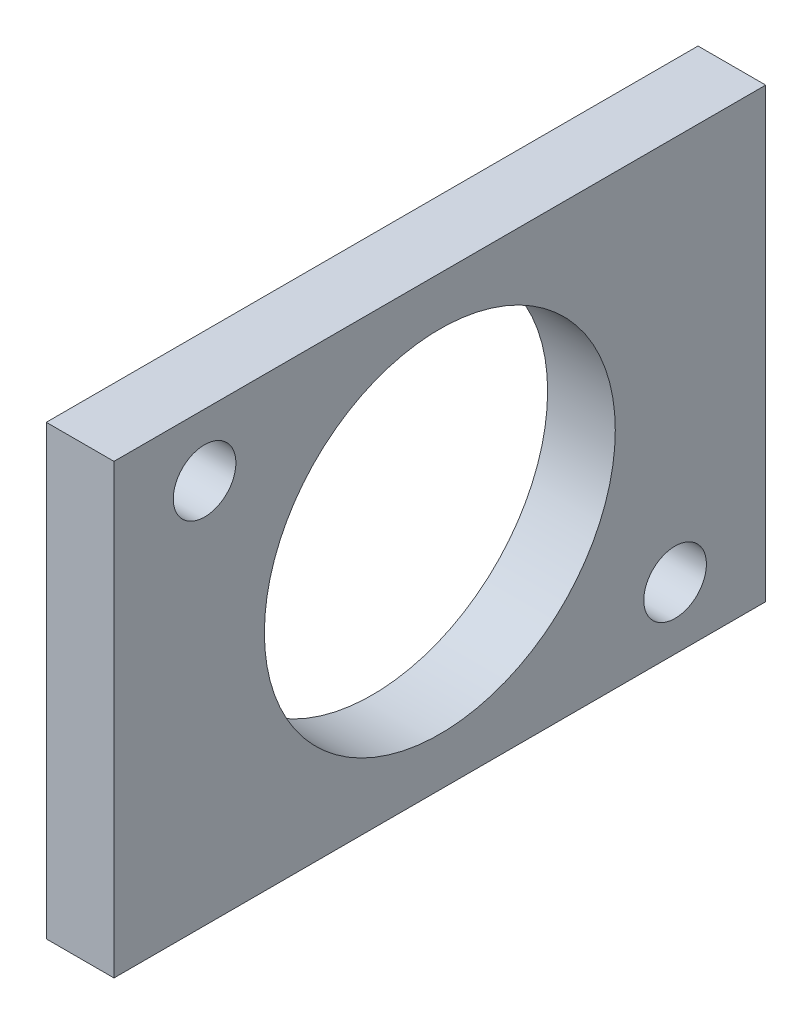
ISO-10303-21;
HEADER;
FILE_DESCRIPTION(('STEP AP214'),'2;1');
FILE_NAME('part.step','',(''),(''),'','','');
FILE_SCHEMA(('AUTOMOTIVE_DESIGN { 1 0 10303 214 1 1 1 1 }'));
ENDSEC;
DATA;
#1=APPLICATION_CONTEXT('core data for automotive mechanical design processes');
#2=APPLICATION_PROTOCOL_DEFINITION('international standard','automotive_design',2000,#1);
#3=PRODUCT_CONTEXT('',#1,'mechanical');
#4=PRODUCT('Part','Part','',(#3));
#5=PRODUCT_RELATED_PRODUCT_CATEGORY('part','',(#4));
#6=PRODUCT_DEFINITION_FORMATION('','',#4);
#7=PRODUCT_DEFINITION_CONTEXT('part definition',#1,'design');
#8=PRODUCT_DEFINITION('design','',#6,#7);
#9=PRODUCT_DEFINITION_SHAPE('','',#8);
#10=(LENGTH_UNIT() NAMED_UNIT(*) SI_UNIT(.MILLI.,.METRE.));
#11=(NAMED_UNIT(*) PLANE_ANGLE_UNIT() SI_UNIT($,.RADIAN.));
#12=(NAMED_UNIT(*) SI_UNIT($,.STERADIAN.) SOLID_ANGLE_UNIT());
#13=UNCERTAINTY_MEASURE_WITH_UNIT(LENGTH_MEASURE(1.E-05),#10,'distance_accuracy_value','');
#14=(GEOMETRIC_REPRESENTATION_CONTEXT(3) GLOBAL_UNCERTAINTY_ASSIGNED_CONTEXT((#13)) GLOBAL_UNIT_ASSIGNED_CONTEXT((#10,
#11,#12)) REPRESENTATION_CONTEXT('',''));
#15=CARTESIAN_POINT('',(0.,0.,0.));
#16=DIRECTION('',(0.,0.,1.));
#17=DIRECTION('',(1.,0.,0.));
#18=AXIS2_PLACEMENT_3D('',#15,#16,#17);
#19=CARTESIAN_POINT('',(5.4,17.85,-26.));
#20=DIRECTION('',(0.,0.,1.));
#21=DIRECTION('',(1.,0.,0.));
#22=AXIS2_PLACEMENT_3D('',#19,#20,#21);
#23=PLANE('',#22);
#24=DIRECTION('',(0.,1.,0.));
#25=VECTOR('',#24,1.);
#26=CARTESIAN_POINT('',(0.,17.85,-26.));
#27=LINE('',#26,#25);
#28=CARTESIAN_POINT('',(0.,-17.85,-26.));
#29=VERTEX_POINT('',#28);
#30=CARTESIAN_POINT('',(0.,17.85,-26.));
#31=VERTEX_POINT('',#30);
#32=EDGE_CURVE('E113',#29,#31,#27,.T.);
#33=ORIENTED_EDGE('',*,*,#32,.T.);
#34=DIRECTION('',(-1.,0.,0.));
#35=VECTOR('',#34,1.);
#36=CARTESIAN_POINT('',(5.4,17.85,-26.));
#37=LINE('',#36,#35);
#38=CARTESIAN_POINT('',(5.4,17.85,-26.));
#39=VERTEX_POINT('',#38);
#40=EDGE_CURVE('E11',#39,#31,#37,.T.);
#41=ORIENTED_EDGE('',*,*,#40,.F.);
#42=DIRECTION('',(0.,1.,0.));
#43=VECTOR('',#42,1.);
#44=CARTESIAN_POINT('',(5.4,17.85,-26.));
#45=LINE('',#44,#43);
#46=CARTESIAN_POINT('',(5.4,-17.85,-26.));
#47=VERTEX_POINT('',#46);
#48=EDGE_CURVE('E97',#47,#39,#45,.T.);
#49=ORIENTED_EDGE('',*,*,#48,.F.);
#50=DIRECTION('',(-1.,0.,0.));
#51=VECTOR('',#50,1.);
#52=CARTESIAN_POINT('',(5.4,-17.85,-26.));
#53=LINE('',#52,#51);
#54=EDGE_CURVE('E109',#47,#29,#53,.T.);
#55=ORIENTED_EDGE('',*,*,#54,.T.);
#56=EDGE_LOOP('',(#33,#41,#49,#55));
#57=FACE_BOUND('',#56,.T.);
#58=ADVANCED_FACE('F45',(#57),#23,.F.);
#59=CARTESIAN_POINT('',(5.4,17.85,26.));
#60=DIRECTION('',(0.,-1.,0.));
#61=DIRECTION('',(0.,0.,-1.));
#62=AXIS2_PLACEMENT_3D('',#59,#60,#61);
#63=PLANE('',#62);
#64=DIRECTION('',(0.,0.,1.));
#65=VECTOR('',#64,1.);
#66=CARTESIAN_POINT('',(0.,17.85,26.));
#67=LINE('',#66,#65);
#68=CARTESIAN_POINT('',(0.,17.85,26.));
#69=VERTEX_POINT('',#68);
#70=EDGE_CURVE('E102',#31,#69,#67,.T.);
#71=ORIENTED_EDGE('',*,*,#70,.T.);
#72=DIRECTION('',(-1.,0.,0.));
#73=VECTOR('',#72,1.);
#74=CARTESIAN_POINT('',(5.4,17.85,26.));
#75=LINE('',#74,#73);
#76=CARTESIAN_POINT('',(5.4,17.85,26.));
#77=VERTEX_POINT('',#76);
#78=EDGE_CURVE('E54',#77,#69,#75,.T.);
#79=ORIENTED_EDGE('',*,*,#78,.F.);
#80=DIRECTION('',(0.,0.,1.));
#81=VECTOR('',#80,1.);
#82=CARTESIAN_POINT('',(5.4,17.85,26.));
#83=LINE('',#82,#81);
#84=EDGE_CURVE('E92',#39,#77,#83,.T.);
#85=ORIENTED_EDGE('',*,*,#84,.F.);
#86=ORIENTED_EDGE('',*,*,#40,.T.);
#87=EDGE_LOOP('',(#71,#79,#85,#86));
#88=FACE_BOUND('',#87,.T.);
#89=ADVANCED_FACE('F101',(#88),#63,.F.);
#90=CARTESIAN_POINT('',(5.4,17.85,26.));
#91=DIRECTION('',(0.,0.,-1.));
#92=DIRECTION('',(0.,1.,0.));
#93=AXIS2_PLACEMENT_3D('',#90,#91,#92);
#94=PLANE('',#93);
#95=DIRECTION('',(0.,-1.,0.));
#96=VECTOR('',#95,1.);
#97=CARTESIAN_POINT('',(0.,17.85,26.));
#98=LINE('',#97,#96);
#99=CARTESIAN_POINT('',(0.,-17.85,26.));
#100=VERTEX_POINT('',#99);
#101=EDGE_CURVE('E79',#69,#100,#98,.T.);
#102=ORIENTED_EDGE('',*,*,#101,.T.);
#103=DIRECTION('',(-1.,0.,0.));
#104=VECTOR('',#103,1.);
#105=CARTESIAN_POINT('',(5.4,-17.85,26.));
#106=LINE('',#105,#104);
#107=CARTESIAN_POINT('',(5.4,-17.85,26.));
#108=VERTEX_POINT('',#107);
#109=EDGE_CURVE('E104',#108,#100,#106,.T.);
#110=ORIENTED_EDGE('',*,*,#109,.F.);
#111=DIRECTION('',(0.,-1.,0.));
#112=VECTOR('',#111,1.);
#113=CARTESIAN_POINT('',(5.4,17.85,26.));
#114=LINE('',#113,#112);
#115=EDGE_CURVE('E95',#77,#108,#114,.T.);
#116=ORIENTED_EDGE('',*,*,#115,.F.);
#117=ORIENTED_EDGE('',*,*,#78,.T.);
#118=EDGE_LOOP('',(#102,#110,#116,#117));
#119=FACE_BOUND('',#118,.T.);
#120=ADVANCED_FACE('F105',(#119),#94,.F.);
#121=CARTESIAN_POINT('',(5.4,-17.85,26.));
#122=DIRECTION('',(0.,1.,0.));
#123=DIRECTION('',(0.,0.,1.));
#124=AXIS2_PLACEMENT_3D('',#121,#122,#123);
#125=PLANE('',#124);
#126=DIRECTION('',(0.,0.,-1.));
#127=VECTOR('',#126,1.);
#128=CARTESIAN_POINT('',(0.,-17.85,26.));
#129=LINE('',#128,#127);
#130=EDGE_CURVE('E85',#100,#29,#129,.T.);
#131=ORIENTED_EDGE('',*,*,#130,.T.);
#132=ORIENTED_EDGE('',*,*,#54,.F.);
#133=DIRECTION('',(0.,0.,-1.));
#134=VECTOR('',#133,1.);
#135=CARTESIAN_POINT('',(5.4,-17.85,26.));
#136=LINE('',#135,#134);
#137=EDGE_CURVE('E62',#108,#47,#136,.T.);
#138=ORIENTED_EDGE('',*,*,#137,.F.);
#139=ORIENTED_EDGE('',*,*,#109,.T.);
#140=EDGE_LOOP('',(#131,#132,#138,#139));
#141=FACE_BOUND('',#140,.T.);
#142=ADVANCED_FACE('F127',(#141),#125,.F.);
#143=CARTESIAN_POINT('',(5.4,0.,0.));
#144=DIRECTION('',(1.,0.,0.));
#145=DIRECTION('',(0.,0.,-1.));
#146=AXIS2_PLACEMENT_3D('',#143,#144,#145);
#147=PLANE('',#146);
#148=CARTESIAN_POINT('',(5.4,-12.8869329433704,-18.7708827186347));
#149=DIRECTION('',(1.,0.,0.));
#150=DIRECTION('',(0.,0.,-1.));
#151=AXIS2_PLACEMENT_3D('',#148,#149,#150);
#152=CIRCLE('',#151,2.5);
#153=CARTESIAN_POINT('',(5.4,-12.8869329433704,-21.2708827186347));
#154=VERTEX_POINT('',#153);
#155=EDGE_CURVE('E146',#154,#154,#152,.T.);
#156=ORIENTED_EDGE('',*,*,#155,.F.);
#157=EDGE_LOOP('',(#156));
#158=FACE_BOUND('',#157,.T.);
#159=CARTESIAN_POINT('',(5.4,12.8869329433704,18.7708827186347));
#160=DIRECTION('',(1.,0.,0.));
#161=DIRECTION('',(0.,0.,-1.));
#162=AXIS2_PLACEMENT_3D('',#159,#160,#161);
#163=CIRCLE('',#162,2.5);
#164=CARTESIAN_POINT('',(5.4,12.8869329433704,16.2708827186347));
#165=VERTEX_POINT('',#164);
#166=EDGE_CURVE('E138',#165,#165,#163,.T.);
#167=ORIENTED_EDGE('',*,*,#166,.F.);
#168=EDGE_LOOP('',(#167));
#169=FACE_BOUND('',#168,.T.);
#170=CARTESIAN_POINT('',(5.4,0.,0.));
#171=DIRECTION('',(1.,0.,0.));
#172=DIRECTION('',(0.,0.,-1.));
#173=AXIS2_PLACEMENT_3D('',#170,#171,#172);
#174=CIRCLE('',#173,14.);
#175=CARTESIAN_POINT('',(5.4,0.,-14.));
#176=VERTEX_POINT('',#175);
#177=EDGE_CURVE('E134',#176,#176,#174,.T.);
#178=ORIENTED_EDGE('',*,*,#177,.F.);
#179=EDGE_LOOP('',(#178));
#180=FACE_BOUND('',#179,.T.);
#181=ORIENTED_EDGE('',*,*,#48,.T.);
#182=ORIENTED_EDGE('',*,*,#84,.T.);
#183=ORIENTED_EDGE('',*,*,#115,.T.);
#184=ORIENTED_EDGE('',*,*,#137,.T.);
#185=EDGE_LOOP('',(#181,#182,#183,#184));
#186=FACE_BOUND('',#185,.T.);
#187=ADVANCED_FACE('F93',(#158,#169,#180,#186),#147,.T.);
#188=CARTESIAN_POINT('',(0.,0.,0.));
#189=DIRECTION('',(1.,0.,0.));
#190=DIRECTION('',(0.,0.,-1.));
#191=AXIS2_PLACEMENT_3D('',#188,#189,#190);
#192=PLANE('',#191);
#193=CARTESIAN_POINT('',(0.,-12.8869329433704,-18.7708827186347));
#194=DIRECTION('',(1.,0.,0.));
#195=DIRECTION('',(0.,0.,-1.));
#196=AXIS2_PLACEMENT_3D('',#193,#194,#195);
#197=CIRCLE('',#196,2.5);
#198=CARTESIAN_POINT('',(0.,-12.8869329433704,-21.2708827186347));
#199=VERTEX_POINT('',#198);
#200=EDGE_CURVE('E142',#199,#199,#197,.T.);
#201=ORIENTED_EDGE('',*,*,#200,.T.);
#202=EDGE_LOOP('',(#201));
#203=FACE_BOUND('',#202,.T.);
#204=CARTESIAN_POINT('',(0.,12.8869329433704,18.7708827186347));
#205=DIRECTION('',(1.,0.,0.));
#206=DIRECTION('',(0.,0.,-1.));
#207=AXIS2_PLACEMENT_3D('',#204,#205,#206);
#208=CIRCLE('',#207,2.5);
#209=CARTESIAN_POINT('',(0.,12.8869329433704,16.2708827186347));
#210=VERTEX_POINT('',#209);
#211=EDGE_CURVE('E150',#210,#210,#208,.T.);
#212=ORIENTED_EDGE('',*,*,#211,.T.);
#213=EDGE_LOOP('',(#212));
#214=FACE_BOUND('',#213,.T.);
#215=CARTESIAN_POINT('',(0.,0.,0.));
#216=DIRECTION('',(1.,0.,0.));
#217=DIRECTION('',(0.,0.,-1.));
#218=AXIS2_PLACEMENT_3D('',#215,#216,#217);
#219=CIRCLE('',#218,14.);
#220=CARTESIAN_POINT('',(0.,0.,-14.));
#221=VERTEX_POINT('',#220);
#222=EDGE_CURVE('E117',#221,#221,#219,.T.);
#223=ORIENTED_EDGE('',*,*,#222,.T.);
#224=EDGE_LOOP('',(#223));
#225=FACE_BOUND('',#224,.T.);
#226=ORIENTED_EDGE('',*,*,#32,.F.);
#227=ORIENTED_EDGE('',*,*,#130,.F.);
#228=ORIENTED_EDGE('',*,*,#101,.F.);
#229=ORIENTED_EDGE('',*,*,#70,.F.);
#230=EDGE_LOOP('',(#226,#227,#228,#229));
#231=FACE_BOUND('',#230,.T.);
#232=ADVANCED_FACE('F130',(#203,#214,#225,#231),#192,.F.);
#233=CARTESIAN_POINT('',(0.,0.,0.));
#234=DIRECTION('',(1.,0.,0.));
#235=DIRECTION('',(0.,0.,-1.));
#236=AXIS2_PLACEMENT_3D('',#233,#234,#235);
#237=CYLINDRICAL_SURFACE('',#236,14.);
#238=CARTESIAN_POINT('',(0.,0.,-14.));
#239=CARTESIAN_POINT('',(0.05625,0.,-14.));
#240=CARTESIAN_POINT('',(0.1125,0.,-14.));
#241=CARTESIAN_POINT('',(0.225,0.,-14.));
#242=CARTESIAN_POINT('',(0.28125,0.,-14.));
#243=CARTESIAN_POINT('',(0.39375,0.,-14.));
#244=CARTESIAN_POINT('',(0.45,0.,-14.));
#245=CARTESIAN_POINT('',(0.5625,0.,-14.));
#246=CARTESIAN_POINT('',(0.61875,0.,-14.));
#247=CARTESIAN_POINT('',(0.73125,0.,-14.));
#248=CARTESIAN_POINT('',(0.7875,0.,-14.));
#249=CARTESIAN_POINT('',(0.9,0.,-14.));
#250=CARTESIAN_POINT('',(0.95625,0.,-14.));
#251=CARTESIAN_POINT('',(1.06875,0.,-14.));
#252=CARTESIAN_POINT('',(1.125,0.,-14.));
#253=CARTESIAN_POINT('',(1.2375,0.,-14.));
#254=CARTESIAN_POINT('',(1.29375,0.,-14.));
#255=CARTESIAN_POINT('',(1.40625,0.,-14.));
#256=CARTESIAN_POINT('',(1.4625,0.,-14.));
#257=CARTESIAN_POINT('',(1.575,0.,-14.));
#258=CARTESIAN_POINT('',(1.63125,0.,-14.));
#259=CARTESIAN_POINT('',(1.74375,0.,-14.));
#260=CARTESIAN_POINT('',(1.8,0.,-14.));
#261=CARTESIAN_POINT('',(1.9125,0.,-14.));
#262=CARTESIAN_POINT('',(1.96875,0.,-14.));
#263=CARTESIAN_POINT('',(2.08125,0.,-14.));
#264=CARTESIAN_POINT('',(2.1375,0.,-14.));
#265=CARTESIAN_POINT('',(2.25,0.,-14.));
#266=CARTESIAN_POINT('',(2.30625,0.,-14.));
#267=CARTESIAN_POINT('',(2.41875,0.,-14.));
#268=CARTESIAN_POINT('',(2.475,0.,-14.));
#269=CARTESIAN_POINT('',(2.5875,0.,-14.));
#270=CARTESIAN_POINT('',(2.64375,0.,-14.));
#271=CARTESIAN_POINT('',(2.75625,0.,-14.));
#272=CARTESIAN_POINT('',(2.8125,0.,-14.));
#273=CARTESIAN_POINT('',(2.925,0.,-14.));
#274=CARTESIAN_POINT('',(2.98125,0.,-14.));
#275=CARTESIAN_POINT('',(3.09375,0.,-14.));
#276=CARTESIAN_POINT('',(3.15,0.,-14.));
#277=CARTESIAN_POINT('',(3.2625,0.,-14.));
#278=CARTESIAN_POINT('',(3.31875,0.,-14.));
#279=CARTESIAN_POINT('',(3.43125,0.,-14.));
#280=CARTESIAN_POINT('',(3.4875,0.,-14.));
#281=CARTESIAN_POINT('',(3.6,0.,-14.));
#282=CARTESIAN_POINT('',(3.65625,0.,-14.));
#283=CARTESIAN_POINT('',(3.76875,0.,-14.));
#284=CARTESIAN_POINT('',(3.825,0.,-14.));
#285=CARTESIAN_POINT('',(3.9375,0.,-14.));
#286=CARTESIAN_POINT('',(3.99375,0.,-14.));
#287=CARTESIAN_POINT('',(4.10625,0.,-14.));
#288=CARTESIAN_POINT('',(4.1625,0.,-14.));
#289=CARTESIAN_POINT('',(4.275,0.,-14.));
#290=CARTESIAN_POINT('',(4.33125,0.,-14.));
#291=CARTESIAN_POINT('',(4.44375,0.,-14.));
#292=CARTESIAN_POINT('',(4.5,0.,-14.));
#293=CARTESIAN_POINT('',(4.6125,0.,-14.));
#294=CARTESIAN_POINT('',(4.66875,0.,-14.));
#295=CARTESIAN_POINT('',(4.78125,0.,-14.));
#296=CARTESIAN_POINT('',(4.8375,0.,-14.));
#297=CARTESIAN_POINT('',(4.95,0.,-14.));
#298=CARTESIAN_POINT('',(5.00625,0.,-14.));
#299=CARTESIAN_POINT('',(5.11875,0.,-14.));
#300=CARTESIAN_POINT('',(5.175,0.,-14.));
#301=CARTESIAN_POINT('',(5.2875,0.,-14.));
#302=CARTESIAN_POINT('',(5.34375,0.,-14.));
#303=CARTESIAN_POINT('',(5.4,0.,-14.));
#304=B_SPLINE_CURVE_WITH_KNOTS('',3,(#238,#239,#240,#241,#242,#243,#244,#245,#246,#247,#248,
#249,#250,#251,#252,#253,#254,#255,#256,#257,#258,#259,#260,#261,#262,#263,#264,#265,#266,#267,
#268,#269,#270,#271,#272,#273,#274,#275,#276,#277,#278,#279,#280,#281,#282,#283,#284,#285,#286,
#287,#288,#289,#290,#291,#292,#293,#294,#295,#296,#297,#298,#299,#300,#301,#302,#303),
.UNSPECIFIED.,.F.,.F.,(4,2,2,2,2,2,2,2,2,2,2,2,2,2,2,2,2,2,2,2,2,2,2,2,2,2,2,2,2,2,2,2,4),(0.,
0.16875,0.3375,0.50625,0.675,0.84375,1.0125,1.18125,1.35,1.51875,1.6875,1.85625,2.025,2.19375,
2.3625,2.53125,2.7,2.86875,3.0375,3.20625,3.375,3.54375,3.7125,3.88125,4.05,4.21875,4.3875,
4.55625,4.725,4.89375,5.0625,5.23125,5.4),.UNSPECIFIED.);
#305=EDGE_CURVE('BSEAM166',#221,#176,#304,.T.);
#306=ORIENTED_EDGE('',*,*,#222,.F.);
#307=ORIENTED_EDGE('',*,*,#177,.T.);
#308=ORIENTED_EDGE('',*,*,#305,.T.);
#309=ORIENTED_EDGE('',*,*,#305,.F.);
#310=EDGE_LOOP('',(#306,#308,#307,#309));
#311=FACE_BOUND('',#310,.T.);
#312=ADVANCED_FACE('F166',(#311),#237,.F.);
#313=CARTESIAN_POINT('',(0.,12.8869329433704,18.7708827186347));
#314=DIRECTION('',(1.,0.,0.));
#315=DIRECTION('',(0.,0.,-1.));
#316=AXIS2_PLACEMENT_3D('',#313,#314,#315);
#317=CYLINDRICAL_SURFACE('',#316,2.5);
#318=CARTESIAN_POINT('',(0.,12.8869329433704,16.2708827186347));
#319=CARTESIAN_POINT('',(0.05625,12.8869329433704,16.2708827186347));
#320=CARTESIAN_POINT('',(0.1125,12.8869329433704,16.2708827186347));
#321=CARTESIAN_POINT('',(0.225,12.8869329433704,16.2708827186347));
#322=CARTESIAN_POINT('',(0.28125,12.8869329433704,16.2708827186347));
#323=CARTESIAN_POINT('',(0.39375,12.8869329433704,16.2708827186347));
#324=CARTESIAN_POINT('',(0.45,12.8869329433704,16.2708827186347));
#325=CARTESIAN_POINT('',(0.5625,12.8869329433704,16.2708827186347));
#326=CARTESIAN_POINT('',(0.61875,12.8869329433704,16.2708827186347));
#327=CARTESIAN_POINT('',(0.73125,12.8869329433704,16.2708827186347));
#328=CARTESIAN_POINT('',(0.7875,12.8869329433704,16.2708827186347));
#329=CARTESIAN_POINT('',(0.9,12.8869329433704,16.2708827186347));
#330=CARTESIAN_POINT('',(0.95625,12.8869329433704,16.2708827186347));
#331=CARTESIAN_POINT('',(1.06875,12.8869329433704,16.2708827186347));
#332=CARTESIAN_POINT('',(1.125,12.8869329433704,16.2708827186347));
#333=CARTESIAN_POINT('',(1.2375,12.8869329433704,16.2708827186347));
#334=CARTESIAN_POINT('',(1.29375,12.8869329433704,16.2708827186347));
#335=CARTESIAN_POINT('',(1.40625,12.8869329433704,16.2708827186347));
#336=CARTESIAN_POINT('',(1.4625,12.8869329433704,16.2708827186347));
#337=CARTESIAN_POINT('',(1.575,12.8869329433704,16.2708827186347));
#338=CARTESIAN_POINT('',(1.63125,12.8869329433704,16.2708827186347));
#339=CARTESIAN_POINT('',(1.74375,12.8869329433704,16.2708827186347));
#340=CARTESIAN_POINT('',(1.8,12.8869329433704,16.2708827186347));
#341=CARTESIAN_POINT('',(1.9125,12.8869329433704,16.2708827186347));
#342=CARTESIAN_POINT('',(1.96875,12.8869329433704,16.2708827186347));
#343=CARTESIAN_POINT('',(2.08125,12.8869329433704,16.2708827186347));
#344=CARTESIAN_POINT('',(2.1375,12.8869329433704,16.2708827186347));
#345=CARTESIAN_POINT('',(2.25,12.8869329433704,16.2708827186347));
#346=CARTESIAN_POINT('',(2.30625,12.8869329433704,16.2708827186347));
#347=CARTESIAN_POINT('',(2.41875,12.8869329433704,16.2708827186347));
#348=CARTESIAN_POINT('',(2.475,12.8869329433704,16.2708827186347));
#349=CARTESIAN_POINT('',(2.5875,12.8869329433704,16.2708827186347));
#350=CARTESIAN_POINT('',(2.64375,12.8869329433704,16.2708827186347));
#351=CARTESIAN_POINT('',(2.75625,12.8869329433704,16.2708827186347));
#352=CARTESIAN_POINT('',(2.8125,12.8869329433704,16.2708827186347));
#353=CARTESIAN_POINT('',(2.925,12.8869329433704,16.2708827186347));
#354=CARTESIAN_POINT('',(2.98125,12.8869329433704,16.2708827186347));
#355=CARTESIAN_POINT('',(3.09375,12.8869329433704,16.2708827186347));
#356=CARTESIAN_POINT('',(3.15,12.8869329433704,16.2708827186347));
#357=CARTESIAN_POINT('',(3.2625,12.8869329433704,16.2708827186347));
#358=CARTESIAN_POINT('',(3.31875,12.8869329433704,16.2708827186347));
#359=CARTESIAN_POINT('',(3.43125,12.8869329433704,16.2708827186347));
#360=CARTESIAN_POINT('',(3.4875,12.8869329433704,16.2708827186347));
#361=CARTESIAN_POINT('',(3.6,12.8869329433704,16.2708827186347));
#362=CARTESIAN_POINT('',(3.65625,12.8869329433704,16.2708827186347));
#363=CARTESIAN_POINT('',(3.76875,12.8869329433704,16.2708827186347));
#364=CARTESIAN_POINT('',(3.825,12.8869329433704,16.2708827186347));
#365=CARTESIAN_POINT('',(3.9375,12.8869329433704,16.2708827186347));
#366=CARTESIAN_POINT('',(3.99375,12.8869329433704,16.2708827186347));
#367=CARTESIAN_POINT('',(4.10625,12.8869329433704,16.2708827186347));
#368=CARTESIAN_POINT('',(4.1625,12.8869329433704,16.2708827186347));
#369=CARTESIAN_POINT('',(4.275,12.8869329433704,16.2708827186347));
#370=CARTESIAN_POINT('',(4.33125,12.8869329433704,16.2708827186347));
#371=CARTESIAN_POINT('',(4.44375,12.8869329433704,16.2708827186347));
#372=CARTESIAN_POINT('',(4.5,12.8869329433704,16.2708827186347));
#373=CARTESIAN_POINT('',(4.6125,12.8869329433704,16.2708827186347));
#374=CARTESIAN_POINT('',(4.66875,12.8869329433704,16.2708827186347));
#375=CARTESIAN_POINT('',(4.78125,12.8869329433704,16.2708827186347));
#376=CARTESIAN_POINT('',(4.8375,12.8869329433704,16.2708827186347));
#377=CARTESIAN_POINT('',(4.95,12.8869329433704,16.2708827186347));
#378=CARTESIAN_POINT('',(5.00625,12.8869329433704,16.2708827186347));
#379=CARTESIAN_POINT('',(5.11875,12.8869329433704,16.2708827186347));
#380=CARTESIAN_POINT('',(5.175,12.8869329433704,16.2708827186347));
#381=CARTESIAN_POINT('',(5.2875,12.8869329433704,16.2708827186347));
#382=CARTESIAN_POINT('',(5.34375,12.8869329433704,16.2708827186347));
#383=CARTESIAN_POINT('',(5.4,12.8869329433704,16.2708827186347));
#384=B_SPLINE_CURVE_WITH_KNOTS('',3,(#318,#319,#320,#321,#322,#323,#324,#325,#326,#327,#328,
#329,#330,#331,#332,#333,#334,#335,#336,#337,#338,#339,#340,#341,#342,#343,#344,#345,#346,#347,
#348,#349,#350,#351,#352,#353,#354,#355,#356,#357,#358,#359,#360,#361,#362,#363,#364,#365,#366,
#367,#368,#369,#370,#371,#372,#373,#374,#375,#376,#377,#378,#379,#380,#381,#382,#383),
.UNSPECIFIED.,.F.,.F.,(4,2,2,2,2,2,2,2,2,2,2,2,2,2,2,2,2,2,2,2,2,2,2,2,2,2,2,2,2,2,2,2,4),(0.,
0.16875,0.3375,0.50625,0.675,0.84375,1.0125,1.18125,1.35,1.51875,1.6875,1.85625,2.025,2.19375,
2.3625,2.53125,2.7,2.86875,3.0375,3.20625,3.375,3.54375,3.7125,3.88125,4.05,4.21875,4.3875,
4.55625,4.725,4.89375,5.0625,5.23125,5.4),.UNSPECIFIED.);
#385=EDGE_CURVE('BSEAM158',#210,#165,#384,.T.);
#386=ORIENTED_EDGE('',*,*,#211,.F.);
#387=ORIENTED_EDGE('',*,*,#166,.T.);
#388=ORIENTED_EDGE('',*,*,#385,.T.);
#389=ORIENTED_EDGE('',*,*,#385,.F.);
#390=EDGE_LOOP('',(#386,#388,#387,#389));
#391=FACE_BOUND('',#390,.T.);
#392=ADVANCED_FACE('F158',(#391),#317,.F.);
#393=CARTESIAN_POINT('',(0.,-12.8869329433704,-18.7708827186347));
#394=DIRECTION('',(1.,0.,0.));
#395=DIRECTION('',(0.,0.,-1.));
#396=AXIS2_PLACEMENT_3D('',#393,#394,#395);
#397=CYLINDRICAL_SURFACE('',#396,2.5);
#398=CARTESIAN_POINT('',(0.,-12.8869329433704,-21.2708827186347));
#399=CARTESIAN_POINT('',(0.05625,-12.8869329433704,-21.2708827186347));
#400=CARTESIAN_POINT('',(0.1125,-12.8869329433704,-21.2708827186347));
#401=CARTESIAN_POINT('',(0.225,-12.8869329433704,-21.2708827186347));
#402=CARTESIAN_POINT('',(0.28125,-12.8869329433704,-21.2708827186347));
#403=CARTESIAN_POINT('',(0.39375,-12.8869329433704,-21.2708827186347));
#404=CARTESIAN_POINT('',(0.45,-12.8869329433704,-21.2708827186347));
#405=CARTESIAN_POINT('',(0.5625,-12.8869329433704,-21.2708827186347));
#406=CARTESIAN_POINT('',(0.61875,-12.8869329433704,-21.2708827186347));
#407=CARTESIAN_POINT('',(0.73125,-12.8869329433704,-21.2708827186347));
#408=CARTESIAN_POINT('',(0.7875,-12.8869329433704,-21.2708827186347));
#409=CARTESIAN_POINT('',(0.9,-12.8869329433704,-21.2708827186347));
#410=CARTESIAN_POINT('',(0.95625,-12.8869329433704,-21.2708827186347));
#411=CARTESIAN_POINT('',(1.06875,-12.8869329433704,-21.2708827186347));
#412=CARTESIAN_POINT('',(1.125,-12.8869329433704,-21.2708827186347));
#413=CARTESIAN_POINT('',(1.2375,-12.8869329433704,-21.2708827186347));
#414=CARTESIAN_POINT('',(1.29375,-12.8869329433704,-21.2708827186347));
#415=CARTESIAN_POINT('',(1.40625,-12.8869329433704,-21.2708827186347));
#416=CARTESIAN_POINT('',(1.4625,-12.8869329433704,-21.2708827186347));
#417=CARTESIAN_POINT('',(1.575,-12.8869329433704,-21.2708827186347));
#418=CARTESIAN_POINT('',(1.63125,-12.8869329433704,-21.2708827186347));
#419=CARTESIAN_POINT('',(1.74375,-12.8869329433704,-21.2708827186347));
#420=CARTESIAN_POINT('',(1.8,-12.8869329433704,-21.2708827186347));
#421=CARTESIAN_POINT('',(1.9125,-12.8869329433704,-21.2708827186347));
#422=CARTESIAN_POINT('',(1.96875,-12.8869329433704,-21.2708827186347));
#423=CARTESIAN_POINT('',(2.08125,-12.8869329433704,-21.2708827186347));
#424=CARTESIAN_POINT('',(2.1375,-12.8869329433704,-21.2708827186347));
#425=CARTESIAN_POINT('',(2.25,-12.8869329433704,-21.2708827186347));
#426=CARTESIAN_POINT('',(2.30625,-12.8869329433704,-21.2708827186347));
#427=CARTESIAN_POINT('',(2.41875,-12.8869329433704,-21.2708827186347));
#428=CARTESIAN_POINT('',(2.475,-12.8869329433704,-21.2708827186347));
#429=CARTESIAN_POINT('',(2.5875,-12.8869329433704,-21.2708827186347));
#430=CARTESIAN_POINT('',(2.64375,-12.8869329433704,-21.2708827186347));
#431=CARTESIAN_POINT('',(2.75625,-12.8869329433704,-21.2708827186347));
#432=CARTESIAN_POINT('',(2.8125,-12.8869329433704,-21.2708827186347));
#433=CARTESIAN_POINT('',(2.925,-12.8869329433704,-21.2708827186347));
#434=CARTESIAN_POINT('',(2.98125,-12.8869329433704,-21.2708827186347));
#435=CARTESIAN_POINT('',(3.09375,-12.8869329433704,-21.2708827186347));
#436=CARTESIAN_POINT('',(3.15,-12.8869329433704,-21.2708827186347));
#437=CARTESIAN_POINT('',(3.2625,-12.8869329433704,-21.2708827186347));
#438=CARTESIAN_POINT('',(3.31875,-12.8869329433704,-21.2708827186347));
#439=CARTESIAN_POINT('',(3.43125,-12.8869329433704,-21.2708827186347));
#440=CARTESIAN_POINT('',(3.4875,-12.8869329433704,-21.2708827186347));
#441=CARTESIAN_POINT('',(3.6,-12.8869329433704,-21.2708827186347));
#442=CARTESIAN_POINT('',(3.65625,-12.8869329433704,-21.2708827186347));
#443=CARTESIAN_POINT('',(3.76875,-12.8869329433704,-21.2708827186347));
#444=CARTESIAN_POINT('',(3.825,-12.8869329433704,-21.2708827186347));
#445=CARTESIAN_POINT('',(3.9375,-12.8869329433704,-21.2708827186347));
#446=CARTESIAN_POINT('',(3.99375,-12.8869329433704,-21.2708827186347));
#447=CARTESIAN_POINT('',(4.10625,-12.8869329433704,-21.2708827186347));
#448=CARTESIAN_POINT('',(4.1625,-12.8869329433704,-21.2708827186347));
#449=CARTESIAN_POINT('',(4.275,-12.8869329433704,-21.2708827186347));
#450=CARTESIAN_POINT('',(4.33125,-12.8869329433704,-21.2708827186347));
#451=CARTESIAN_POINT('',(4.44375,-12.8869329433704,-21.2708827186347));
#452=CARTESIAN_POINT('',(4.5,-12.8869329433704,-21.2708827186347));
#453=CARTESIAN_POINT('',(4.6125,-12.8869329433704,-21.2708827186347));
#454=CARTESIAN_POINT('',(4.66875,-12.8869329433704,-21.2708827186347));
#455=CARTESIAN_POINT('',(4.78125,-12.8869329433704,-21.2708827186347));
#456=CARTESIAN_POINT('',(4.8375,-12.8869329433704,-21.2708827186347));
#457=CARTESIAN_POINT('',(4.95,-12.8869329433704,-21.2708827186347));
#458=CARTESIAN_POINT('',(5.00625,-12.8869329433704,-21.2708827186347));
#459=CARTESIAN_POINT('',(5.11875,-12.8869329433704,-21.2708827186347));
#460=CARTESIAN_POINT('',(5.175,-12.8869329433704,-21.2708827186347));
#461=CARTESIAN_POINT('',(5.2875,-12.8869329433704,-21.2708827186347));
#462=CARTESIAN_POINT('',(5.34375,-12.8869329433704,-21.2708827186347));
#463=CARTESIAN_POINT('',(5.4,-12.8869329433704,-21.2708827186347));
#464=B_SPLINE_CURVE_WITH_KNOTS('',3,(#398,#399,#400,#401,#402,#403,#404,#405,#406,#407,#408,
#409,#410,#411,#412,#413,#414,#415,#416,#417,#418,#419,#420,#421,#422,#423,#424,#425,#426,#427,
#428,#429,#430,#431,#432,#433,#434,#435,#436,#437,#438,#439,#440,#441,#442,#443,#444,#445,#446,
#447,#448,#449,#450,#451,#452,#453,#454,#455,#456,#457,#458,#459,#460,#461,#462,#463),
.UNSPECIFIED.,.F.,.F.,(4,2,2,2,2,2,2,2,2,2,2,2,2,2,2,2,2,2,2,2,2,2,2,2,2,2,2,2,2,2,2,2,4),(0.,
0.16875,0.3375,0.50625,0.675,0.84375,1.0125,1.18125,1.35,1.51875,1.6875,1.85625,2.025,2.19375,
2.3625,2.53125,2.7,2.86875,3.0375,3.20625,3.375,3.54375,3.7125,3.88125,4.05,4.21875,4.3875,
4.55625,4.725,4.89375,5.0625,5.23125,5.4),.UNSPECIFIED.);
#465=EDGE_CURVE('BSEAM174',#199,#154,#464,.T.);
#466=ORIENTED_EDGE('',*,*,#200,.F.);
#467=ORIENTED_EDGE('',*,*,#155,.T.);
#468=ORIENTED_EDGE('',*,*,#465,.T.);
#469=ORIENTED_EDGE('',*,*,#465,.F.);
#470=EDGE_LOOP('',(#466,#468,#467,#469));
#471=FACE_BOUND('',#470,.T.);
#472=ADVANCED_FACE('F174',(#471),#397,.F.);
#473=CLOSED_SHELL('',(#58,#89,#120,#142,#187,#232,#312,#392,#472));
#474=MANIFOLD_SOLID_BREP('B2',#473);
#475=ADVANCED_BREP_SHAPE_REPRESENTATION('',(#18,#474),#14);
#476=SHAPE_DEFINITION_REPRESENTATION(#9,#475);
ENDSEC;
END-ISO-10303-21;
